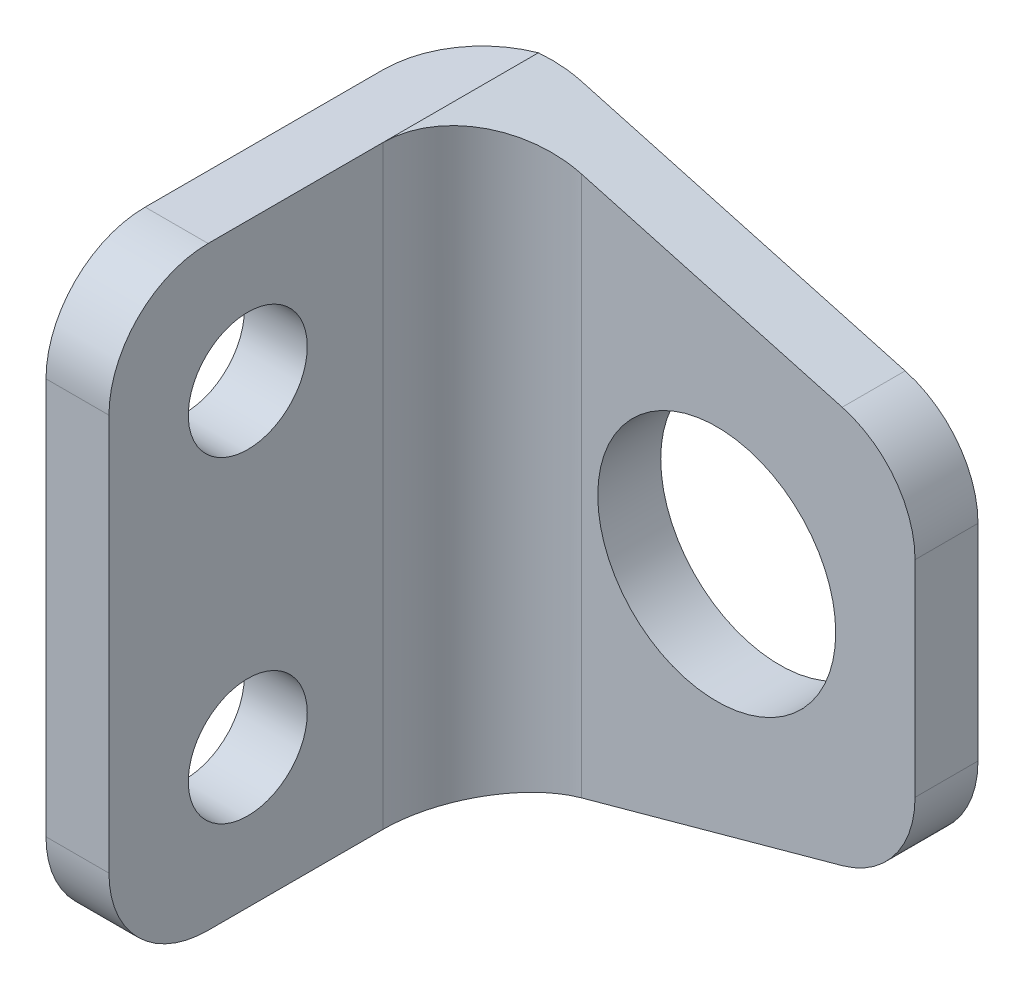
ISO-10303-21;
HEADER;
FILE_DESCRIPTION(('STEP AP214'),'2;1');
FILE_NAME('part.step','',(''),(''),'','','');
FILE_SCHEMA(('AUTOMOTIVE_DESIGN { 1 0 10303 214 1 1 1 1 }'));
ENDSEC;
DATA;
#1=APPLICATION_CONTEXT('core data for automotive mechanical design processes');
#2=APPLICATION_PROTOCOL_DEFINITION('international standard','automotive_design',2000,#1);
#3=PRODUCT_CONTEXT('',#1,'mechanical');
#4=PRODUCT('Part','Part','',(#3));
#5=PRODUCT_RELATED_PRODUCT_CATEGORY('part','',(#4));
#6=PRODUCT_DEFINITION_FORMATION('','',#4);
#7=PRODUCT_DEFINITION_CONTEXT('part definition',#1,'design');
#8=PRODUCT_DEFINITION('design','',#6,#7);
#9=PRODUCT_DEFINITION_SHAPE('','',#8);
#10=(LENGTH_UNIT() NAMED_UNIT(*) SI_UNIT(.MILLI.,.METRE.));
#11=(NAMED_UNIT(*) PLANE_ANGLE_UNIT() SI_UNIT($,.RADIAN.));
#12=(NAMED_UNIT(*) SI_UNIT($,.STERADIAN.) SOLID_ANGLE_UNIT());
#13=UNCERTAINTY_MEASURE_WITH_UNIT(LENGTH_MEASURE(1.E-05),#10,'distance_accuracy_value','');
#14=(GEOMETRIC_REPRESENTATION_CONTEXT(3) GLOBAL_UNCERTAINTY_ASSIGNED_CONTEXT((#13)) GLOBAL_UNIT_ASSIGNED_CONTEXT((#10,
#11,#12)) REPRESENTATION_CONTEXT('',''));
#15=CARTESIAN_POINT('',(0.,0.,0.));
#16=DIRECTION('',(0.,0.,1.));
#17=DIRECTION('',(1.,0.,0.));
#18=AXIS2_PLACEMENT_3D('',#15,#16,#17);
#19=CARTESIAN_POINT('',(3.175,0.,0.));
#20=DIRECTION('',(-1.,0.,0.));
#21=DIRECTION('',(0.,0.,1.));
#22=AXIS2_PLACEMENT_3D('',#19,#20,#21);
#23=PLANE('',#22);
#24=CARTESIAN_POINT('',(3.175,23.,-7.));
#25=DIRECTION('',(1.,0.,0.));
#26=DIRECTION('',(0.,0.,-1.));
#27=AXIS2_PLACEMENT_3D('',#24,#25,#26);
#28=CIRCLE('',#27,3.);
#29=CARTESIAN_POINT('',(3.175,23.,-10.));
#30=VERTEX_POINT('',#29);
#31=EDGE_CURVE('E343',#30,#30,#28,.T.);
#32=ORIENTED_EDGE('',*,*,#31,.F.);
#33=EDGE_LOOP('',(#32));
#34=FACE_BOUND('',#33,.T.);
#35=CARTESIAN_POINT('',(3.175,7.,-7.));
#36=DIRECTION('',(1.,0.,0.));
#37=DIRECTION('',(0.,0.,-1.));
#38=AXIS2_PLACEMENT_3D('',#35,#36,#37);
#39=CIRCLE('',#38,3.);
#40=CARTESIAN_POINT('',(3.175,7.,-10.));
#41=VERTEX_POINT('',#40);
#42=EDGE_CURVE('E339',#41,#41,#39,.T.);
#43=ORIENTED_EDGE('',*,*,#42,.F.);
#44=EDGE_LOOP('',(#43));
#45=FACE_BOUND('',#44,.T.);
#46=DIRECTION('',(0.,0.,1.));
#47=VECTOR('',#46,1.);
#48=CARTESIAN_POINT('',(3.175,30.,0.));
#49=LINE('',#48,#47);
#50=CARTESIAN_POINT('',(3.175,30.,-13.825));
#51=VERTEX_POINT('',#50);
#52=CARTESIAN_POINT('',(3.175,30.,-5.));
#53=VERTEX_POINT('',#52);
#54=EDGE_CURVE('E149',#51,#53,#49,.T.);
#55=ORIENTED_EDGE('',*,*,#54,.T.);
#56=CARTESIAN_POINT('',(3.175,25.,-5.));
#57=DIRECTION('',(-1.,0.,0.));
#58=DIRECTION('',(0.,0.,1.));
#59=AXIS2_PLACEMENT_3D('',#56,#57,#58);
#60=CIRCLE('',#59,5.);
#61=CARTESIAN_POINT('',(3.175,25.,0.));
#62=VERTEX_POINT('',#61);
#63=EDGE_CURVE('E211',#53,#62,#60,.F.);
#64=ORIENTED_EDGE('',*,*,#63,.T.);
#65=DIRECTION('',(0.,-1.,0.));
#66=VECTOR('',#65,1.);
#67=CARTESIAN_POINT('',(3.175,0.,0.));
#68=LINE('',#67,#66);
#69=CARTESIAN_POINT('',(3.175,5.,0.));
#70=VERTEX_POINT('',#69);
#71=EDGE_CURVE('E248',#62,#70,#68,.T.);
#72=ORIENTED_EDGE('',*,*,#71,.T.);
#73=CARTESIAN_POINT('',(3.175,5.,-5.));
#74=DIRECTION('',(-1.,0.,0.));
#75=DIRECTION('',(0.,0.,1.));
#76=AXIS2_PLACEMENT_3D('',#73,#74,#75);
#77=CIRCLE('',#76,5.);
#78=CARTESIAN_POINT('',(3.175,0.,-5.));
#79=VERTEX_POINT('',#78);
#80=EDGE_CURVE('E208',#70,#79,#77,.F.);
#81=ORIENTED_EDGE('',*,*,#80,.T.);
#82=DIRECTION('',(0.,0.,-1.));
#83=VECTOR('',#82,1.);
#84=CARTESIAN_POINT('',(3.175,0.,0.));
#85=LINE('',#84,#83);
#86=CARTESIAN_POINT('',(3.175,0.,-13.825));
#87=VERTEX_POINT('',#86);
#88=EDGE_CURVE('E236',#79,#87,#85,.T.);
#89=ORIENTED_EDGE('',*,*,#88,.T.);
#90=DIRECTION('',(0.,-1.,0.));
#91=VECTOR('',#90,1.);
#92=CARTESIAN_POINT('',(3.175,30.,-13.825));
#93=LINE('',#92,#91);
#94=EDGE_CURVE('E204',#87,#51,#93,.F.);
#95=ORIENTED_EDGE('',*,*,#94,.T.);
#96=EDGE_LOOP('',(#55,#64,#72,#81,#89,#95));
#97=FACE_BOUND('',#96,.T.);
#98=ADVANCED_FACE('F45',(#34,#45,#97),#23,.F.);
#99=CARTESIAN_POINT('',(3.175,0.,0.));
#100=DIRECTION('',(0.,0.,-1.));
#101=DIRECTION('',(-1.,0.,0.));
#102=AXIS2_PLACEMENT_3D('',#99,#100,#101);
#103=PLANE('',#102);
#104=ORIENTED_EDGE('',*,*,#71,.F.);
#105=DIRECTION('',(-1.,0.,0.));
#106=VECTOR('',#105,1.);
#107=CARTESIAN_POINT('',(3.175,25.,0.));
#108=LINE('',#107,#106);
#109=CARTESIAN_POINT('',(0.,25.,0.));
#110=VERTEX_POINT('',#109);
#111=EDGE_CURVE('E185',#62,#110,#108,.T.);
#112=ORIENTED_EDGE('',*,*,#111,.T.);
#113=DIRECTION('',(0.,-1.,0.));
#114=VECTOR('',#113,1.);
#115=CARTESIAN_POINT('',(0.,0.,0.));
#116=LINE('',#115,#114);
#117=CARTESIAN_POINT('',(0.,5.,0.));
#118=VERTEX_POINT('',#117);
#119=EDGE_CURVE('E160',#110,#118,#116,.T.);
#120=ORIENTED_EDGE('',*,*,#119,.T.);
#121=DIRECTION('',(-1.,0.,0.));
#122=VECTOR('',#121,1.);
#123=CARTESIAN_POINT('',(3.175,5.,0.));
#124=LINE('',#123,#122);
#125=EDGE_CURVE('E182',#118,#70,#124,.F.);
#126=ORIENTED_EDGE('',*,*,#125,.T.);
#127=EDGE_LOOP('',(#104,#112,#120,#126));
#128=FACE_BOUND('',#127,.T.);
#129=ADVANCED_FACE('F362',(#128),#103,.F.);
#130=CARTESIAN_POINT('',(3.175,0.,0.));
#131=DIRECTION('',(0.,1.,0.));
#132=DIRECTION('',(0.,0.,1.));
#133=AXIS2_PLACEMENT_3D('',#130,#131,#132);
#134=PLANE('',#133);
#135=ORIENTED_EDGE('',*,*,#88,.F.);
#136=DIRECTION('',(-1.,0.,0.));
#137=VECTOR('',#136,1.);
#138=CARTESIAN_POINT('',(3.175,0.,-5.));
#139=LINE('',#138,#137);
#140=CARTESIAN_POINT('',(0.,0.,-5.));
#141=VERTEX_POINT('',#140);
#142=EDGE_CURVE('E217',#79,#141,#139,.T.);
#143=ORIENTED_EDGE('',*,*,#142,.T.);
#144=DIRECTION('',(0.,0.,-1.));
#145=VECTOR('',#144,1.);
#146=CARTESIAN_POINT('',(0.,0.,0.));
#147=LINE('',#146,#145);
#148=CARTESIAN_POINT('',(0.,0.,-17.));
#149=VERTEX_POINT('',#148);
#150=EDGE_CURVE('E255',#141,#149,#147,.T.);
#151=ORIENTED_EDGE('',*,*,#150,.T.);
#152=CARTESIAN_POINT('',(5.,0.,-17.));
#153=DIRECTION('',(0.,1.,0.));
#154=DIRECTION('',(0.,0.,1.));
#155=AXIS2_PLACEMENT_3D('',#152,#153,#154);
#156=CIRCLE('',#155,5.);
#157=CARTESIAN_POINT('',(3.175,0.,-21.6550375938332));
#158=VERTEX_POINT('',#157);
#159=EDGE_CURVE('E214',#149,#158,#156,.F.);
#160=ORIENTED_EDGE('',*,*,#159,.T.);
#161=DIRECTION('',(0.,0.,-1.));
#162=VECTOR('',#161,1.);
#163=CARTESIAN_POINT('',(3.175,0.,0.001000000000001));
#164=LINE('',#163,#162);
#165=EDGE_CURVE('E62',#87,#158,#164,.T.);
#166=ORIENTED_EDGE('',*,*,#165,.F.);
#167=EDGE_LOOP('',(#135,#143,#151,#160,#166));
#168=FACE_BOUND('',#167,.T.);
#169=ADVANCED_FACE('F307',(#168),#134,.F.);
#170=CARTESIAN_POINT('',(3.175,0.,-22.));
#171=DIRECTION('',(0.,0.,1.));
#172=DIRECTION('',(1.,0.,0.));
#173=AXIS2_PLACEMENT_3D('',#170,#171,#172);
#174=PLANE('',#173);
#175=CARTESIAN_POINT('',(15.,15.,-22.));
#176=DIRECTION('',(0.,0.,-1.));
#177=DIRECTION('',(-1.,0.,0.));
#178=AXIS2_PLACEMENT_3D('',#175,#176,#177);
#179=CIRCLE('',#178,6.);
#180=CARTESIAN_POINT('',(9.,15.,-22.));
#181=VERTEX_POINT('',#180);
#182=EDGE_CURVE('E265',#181,#181,#179,.T.);
#183=ORIENTED_EDGE('',*,*,#182,.F.);
#184=EDGE_LOOP('',(#183));
#185=FACE_BOUND('',#184,.T.);
#186=DIRECTION('',(0.,-1.,0.));
#187=VECTOR('',#186,1.);
#188=CARTESIAN_POINT('',(25.,0.,-22.));
#189=LINE('',#188,#187);
#190=CARTESIAN_POINT('',(25.,20.1890672008548,-22.));
#191=VERTEX_POINT('',#190);
#192=CARTESIAN_POINT('',(25.,9.81093279914521,-22.));
#193=VERTEX_POINT('',#192);
#194=EDGE_CURVE('E144',#191,#193,#189,.T.);
#195=ORIENTED_EDGE('',*,*,#194,.T.);
#196=CARTESIAN_POINT('',(20.,9.81093279914522,-22.));
#197=DIRECTION('',(0.,0.,1.));
#198=DIRECTION('',(1.,0.,0.));
#199=AXIS2_PLACEMENT_3D('',#196,#197,#198);
#200=CIRCLE('',#199,5.);
#201=CARTESIAN_POINT('',(21.325397344826,4.98979995734049,-22.));
#202=VERTEX_POINT('',#201);
#203=EDGE_CURVE('E276',#193,#202,#200,.F.);
#204=ORIENTED_EDGE('',*,*,#203,.T.);
#205=DIRECTION('',(0.964226568360945,0.265079468965208,0.));
#206=VECTOR('',#205,1.);
#207=CARTESIAN_POINT('',(3.175,0.,-22.));
#208=LINE('',#207,#206);
#209=CARTESIAN_POINT('',(5.,0.50171821305842,-22.));
#210=VERTEX_POINT('',#209);
#211=EDGE_CURVE('E284',#210,#202,#208,.T.);
#212=ORIENTED_EDGE('',*,*,#211,.F.);
#213=DIRECTION('',(0.,1.,0.));
#214=VECTOR('',#213,1.);
#215=CARTESIAN_POINT('',(5.,30.,-22.));
#216=LINE('',#215,#214);
#217=CARTESIAN_POINT('',(5.,29.4982817869416,-22.));
#218=VERTEX_POINT('',#217);
#219=EDGE_CURVE('E269',#210,#218,#216,.T.);
#220=ORIENTED_EDGE('',*,*,#219,.T.);
#221=DIRECTION('',(-0.964226568360945,0.265079468965208,0.));
#222=VECTOR('',#221,1.);
#223=CARTESIAN_POINT('',(3.175,30.,-22.));
#224=LINE('',#223,#222);
#225=CARTESIAN_POINT('',(21.325397344826,25.0102000426595,-22.));
#226=VERTEX_POINT('',#225);
#227=EDGE_CURVE('E329',#226,#218,#224,.T.);
#228=ORIENTED_EDGE('',*,*,#227,.F.);
#229=CARTESIAN_POINT('',(20.,20.1890672008548,-22.));
#230=DIRECTION('',(0.,0.,1.));
#231=DIRECTION('',(1.,0.,0.));
#232=AXIS2_PLACEMENT_3D('',#229,#230,#231);
#233=CIRCLE('',#232,5.);
#234=EDGE_CURVE('E273',#226,#191,#233,.F.);
#235=ORIENTED_EDGE('',*,*,#234,.T.);
#236=EDGE_LOOP('',(#195,#204,#212,#220,#228,#235));
#237=FACE_BOUND('',#236,.T.);
#238=ADVANCED_FACE('F291',(#185,#237),#174,.F.);
#239=CARTESIAN_POINT('',(3.175,30.,0.));
#240=DIRECTION('',(0.,-1.,0.));
#241=DIRECTION('',(0.,0.,-1.));
#242=AXIS2_PLACEMENT_3D('',#239,#240,#241);
#243=PLANE('',#242);
#244=DIRECTION('',(0.,0.,1.));
#245=VECTOR('',#244,1.);
#246=CARTESIAN_POINT('',(0.,30.,0.));
#247=LINE('',#246,#245);
#248=CARTESIAN_POINT('',(0.,30.,-17.));
#249=VERTEX_POINT('',#248);
#250=CARTESIAN_POINT('',(0.,30.,-5.));
#251=VERTEX_POINT('',#250);
#252=EDGE_CURVE('E259',#249,#251,#247,.T.);
#253=ORIENTED_EDGE('',*,*,#252,.T.);
#254=DIRECTION('',(-1.,0.,0.));
#255=VECTOR('',#254,1.);
#256=CARTESIAN_POINT('',(3.175,30.,-5.));
#257=LINE('',#256,#255);
#258=EDGE_CURVE('E201',#251,#53,#257,.F.);
#259=ORIENTED_EDGE('',*,*,#258,.T.);
#260=ORIENTED_EDGE('',*,*,#54,.F.);
#261=DIRECTION('',(0.,0.,-1.));
#262=VECTOR('',#261,1.);
#263=CARTESIAN_POINT('',(3.175,30.,0.001000000000001));
#264=LINE('',#263,#262);
#265=CARTESIAN_POINT('',(3.175,30.,-21.6550375938332));
#266=VERTEX_POINT('',#265);
#267=EDGE_CURVE('E242',#51,#266,#264,.T.);
#268=ORIENTED_EDGE('',*,*,#267,.T.);
#269=CARTESIAN_POINT('',(5.,30.,-17.));
#270=DIRECTION('',(0.,-1.,0.));
#271=DIRECTION('',(0.,0.,-1.));
#272=AXIS2_PLACEMENT_3D('',#269,#270,#271);
#273=CIRCLE('',#272,5.);
#274=EDGE_CURVE('E198',#266,#249,#273,.F.);
#275=ORIENTED_EDGE('',*,*,#274,.T.);
#276=EDGE_LOOP('',(#253,#259,#260,#268,#275));
#277=FACE_BOUND('',#276,.T.);
#278=ADVANCED_FACE('F241',(#277),#243,.F.);
#279=CARTESIAN_POINT('',(0.,0.,0.));
#280=DIRECTION('',(-1.,0.,0.));
#281=DIRECTION('',(0.,0.,1.));
#282=AXIS2_PLACEMENT_3D('',#279,#280,#281);
#283=PLANE('',#282);
#284=CARTESIAN_POINT('',(0.,23.,-7.));
#285=DIRECTION('',(1.,0.,0.));
#286=DIRECTION('',(0.,0.,-1.));
#287=AXIS2_PLACEMENT_3D('',#284,#285,#286);
#288=CIRCLE('',#287,3.);
#289=CARTESIAN_POINT('',(0.,23.,-10.));
#290=VERTEX_POINT('',#289);
#291=EDGE_CURVE('E321',#290,#290,#288,.T.);
#292=ORIENTED_EDGE('',*,*,#291,.T.);
#293=EDGE_LOOP('',(#292));
#294=FACE_BOUND('',#293,.T.);
#295=CARTESIAN_POINT('',(0.,7.,-7.));
#296=DIRECTION('',(1.,0.,0.));
#297=DIRECTION('',(0.,0.,-1.));
#298=AXIS2_PLACEMENT_3D('',#295,#296,#297);
#299=CIRCLE('',#298,3.);
#300=CARTESIAN_POINT('',(0.,7.,-10.));
#301=VERTEX_POINT('',#300);
#302=EDGE_CURVE('E335',#301,#301,#299,.T.);
#303=ORIENTED_EDGE('',*,*,#302,.T.);
#304=EDGE_LOOP('',(#303));
#305=FACE_BOUND('',#304,.T.);
#306=ORIENTED_EDGE('',*,*,#119,.F.);
#307=CARTESIAN_POINT('',(0.,25.,-5.));
#308=DIRECTION('',(-1.,0.,0.));
#309=DIRECTION('',(0.,0.,1.));
#310=AXIS2_PLACEMENT_3D('',#307,#308,#309);
#311=CIRCLE('',#310,5.);
#312=EDGE_CURVE('E195',#110,#251,#311,.T.);
#313=ORIENTED_EDGE('',*,*,#312,.T.);
#314=ORIENTED_EDGE('',*,*,#252,.F.);
#315=DIRECTION('',(0.,1.,0.));
#316=VECTOR('',#315,1.);
#317=CARTESIAN_POINT('',(0.,0.,-17.));
#318=LINE('',#317,#316);
#319=EDGE_CURVE('E189',#249,#149,#318,.F.);
#320=ORIENTED_EDGE('',*,*,#319,.T.);
#321=ORIENTED_EDGE('',*,*,#150,.F.);
#322=CARTESIAN_POINT('',(0.,5.,-5.));
#323=DIRECTION('',(-1.,0.,0.));
#324=DIRECTION('',(0.,0.,1.));
#325=AXIS2_PLACEMENT_3D('',#322,#323,#324);
#326=CIRCLE('',#325,5.);
#327=EDGE_CURVE('E192',#141,#118,#326,.T.);
#328=ORIENTED_EDGE('',*,*,#327,.T.);
#329=EDGE_LOOP('',(#306,#313,#314,#320,#321,#328));
#330=FACE_BOUND('',#329,.T.);
#331=ADVANCED_FACE('F311',(#294,#305,#330),#283,.T.);
#332=CARTESIAN_POINT('',(0.,0.,-18.825));
#333=DIRECTION('',(0.,0.,-1.));
#334=DIRECTION('',(-1.,0.,0.));
#335=AXIS2_PLACEMENT_3D('',#332,#333,#334);
#336=PLANE('',#335);
#337=CARTESIAN_POINT('',(15.,15.,-18.825));
#338=DIRECTION('',(0.,0.,-1.));
#339=DIRECTION('',(-1.,0.,0.));
#340=AXIS2_PLACEMENT_3D('',#337,#338,#339);
#341=CIRCLE('',#340,6.);
#342=CARTESIAN_POINT('',(9.,15.,-18.825));
#343=VERTEX_POINT('',#342);
#344=EDGE_CURVE('E262',#343,#343,#341,.T.);
#345=ORIENTED_EDGE('',*,*,#344,.T.);
#346=EDGE_LOOP('',(#345));
#347=FACE_BOUND('',#346,.T.);
#348=DIRECTION('',(-0.964226568360945,-0.265079468965208,0.));
#349=VECTOR('',#348,1.);
#350=CARTESIAN_POINT('',(3.175,0.,-18.825));
#351=LINE('',#350,#349);
#352=CARTESIAN_POINT('',(21.325397344826,4.98979995734049,-18.825));
#353=VERTEX_POINT('',#352);
#354=CARTESIAN_POINT('',(8.175,1.3745704467354,-18.825));
#355=VERTEX_POINT('',#354);
#356=EDGE_CURVE('E228',#353,#355,#351,.T.);
#357=ORIENTED_EDGE('',*,*,#356,.F.);
#358=CARTESIAN_POINT('',(20.,9.81093279914522,-18.825));
#359=DIRECTION('',(0.,0.,-1.));
#360=DIRECTION('',(-1.,0.,0.));
#361=AXIS2_PLACEMENT_3D('',#358,#359,#360);
#362=CIRCLE('',#361,5.);
#363=CARTESIAN_POINT('',(25.,9.81093279914521,-18.825));
#364=VERTEX_POINT('',#363);
#365=EDGE_CURVE('E158',#353,#364,#362,.F.);
#366=ORIENTED_EDGE('',*,*,#365,.T.);
#367=DIRECTION('',(0.,-1.,0.));
#368=VECTOR('',#367,1.);
#369=CARTESIAN_POINT('',(25.,0.,-18.825));
#370=LINE('',#369,#368);
#371=CARTESIAN_POINT('',(25.,20.1890672008548,-18.825));
#372=VERTEX_POINT('',#371);
#373=EDGE_CURVE('E141',#372,#364,#370,.T.);
#374=ORIENTED_EDGE('',*,*,#373,.F.);
#375=CARTESIAN_POINT('',(20.,20.1890672008548,-18.825));
#376=DIRECTION('',(0.,0.,-1.));
#377=DIRECTION('',(-1.,0.,0.));
#378=AXIS2_PLACEMENT_3D('',#375,#376,#377);
#379=CIRCLE('',#378,5.);
#380=CARTESIAN_POINT('',(21.325397344826,25.0102000426595,-18.825));
#381=VERTEX_POINT('',#380);
#382=EDGE_CURVE('E155',#372,#381,#379,.F.);
#383=ORIENTED_EDGE('',*,*,#382,.T.);
#384=DIRECTION('',(0.964226568360945,-0.265079468965208,0.));
#385=VECTOR('',#384,1.);
#386=CARTESIAN_POINT('',(3.175,30.,-18.825));
#387=LINE('',#386,#385);
#388=CARTESIAN_POINT('',(8.175,28.6254295532646,-18.825));
#389=VERTEX_POINT('',#388);
#390=EDGE_CURVE('E287',#389,#381,#387,.T.);
#391=ORIENTED_EDGE('',*,*,#390,.F.);
#392=DIRECTION('',(0.,-1.,0.));
#393=VECTOR('',#392,1.);
#394=CARTESIAN_POINT('',(8.175,0.,-18.825));
#395=LINE('',#394,#393);
#396=EDGE_CURVE('E167',#389,#355,#395,.T.);
#397=ORIENTED_EDGE('',*,*,#396,.T.);
#398=EDGE_LOOP('',(#357,#366,#374,#383,#391,#397));
#399=FACE_BOUND('',#398,.T.);
#400=ADVANCED_FACE('F153',(#347,#399),#336,.F.);
#401=CARTESIAN_POINT('',(25.,0.,-18.825));
#402=DIRECTION('',(1.,0.,0.));
#403=DIRECTION('',(0.,0.,-1.));
#404=AXIS2_PLACEMENT_3D('',#401,#402,#403);
#405=PLANE('',#404);
#406=ORIENTED_EDGE('',*,*,#373,.T.);
#407=DIRECTION('',(0.,0.,-1.));
#408=VECTOR('',#407,1.);
#409=CARTESIAN_POINT('',(25.,9.81093279914522,-22.));
#410=LINE('',#409,#408);
#411=EDGE_CURVE('E148',#364,#193,#410,.T.);
#412=ORIENTED_EDGE('',*,*,#411,.T.);
#413=ORIENTED_EDGE('',*,*,#194,.F.);
#414=DIRECTION('',(0.,0.,-1.));
#415=VECTOR('',#414,1.);
#416=CARTESIAN_POINT('',(25.,20.1890672008548,-18.825));
#417=LINE('',#416,#415);
#418=EDGE_CURVE('E137',#191,#372,#417,.F.);
#419=ORIENTED_EDGE('',*,*,#418,.T.);
#420=EDGE_LOOP('',(#406,#412,#413,#419));
#421=FACE_BOUND('',#420,.T.);
#422=ADVANCED_FACE('F139',(#421),#405,.T.);
#423=CARTESIAN_POINT('',(15.,15.,0.));
#424=DIRECTION('',(0.,0.,-1.));
#425=DIRECTION('',(-1.,0.,0.));
#426=AXIS2_PLACEMENT_3D('',#423,#424,#425);
#427=CYLINDRICAL_SURFACE('',#426,6.);
#428=ORIENTED_EDGE('',*,*,#182,.T.);
#429=EDGE_LOOP('',(#428));
#430=FACE_BOUND('',#429,.T.);
#431=ORIENTED_EDGE('',*,*,#344,.F.);
#432=EDGE_LOOP('',(#431));
#433=FACE_BOUND('',#432,.T.);
#434=ADVANCED_FACE('F381',(#430,#433),#427,.F.);
#435=CARTESIAN_POINT('',(3.175,0.,0.001000000000001));
#436=DIRECTION('',(-0.265079468965208,0.964226568360945,0.));
#437=DIRECTION('',(-0.964226568360945,-0.265079468965208,0.));
#438=AXIS2_PLACEMENT_3D('',#435,#436,#437);
#439=PLANE('',#438);
#440=ORIENTED_EDGE('',*,*,#211,.T.);
#441=DIRECTION('',(0.,0.,-1.));
#442=VECTOR('',#441,1.);
#443=CARTESIAN_POINT('',(21.325397344826,4.98979995734049,-18.825));
#444=LINE('',#443,#442);
#445=EDGE_CURVE('E174',#202,#353,#444,.F.);
#446=ORIENTED_EDGE('',*,*,#445,.T.);
#447=ORIENTED_EDGE('',*,*,#356,.T.);
#448=CARTESIAN_POINT('',(8.175,1.3745704467354,-13.825));
#449=DIRECTION('',(-0.265079468965208,0.964226568360945,0.));
#450=DIRECTION('',(0.964226568360945,0.265079468965208,0.));
#451=AXIS2_PLACEMENT_3D('',#448,#449,#450);
#452=ELLIPSE('',#451,5.18550324588061,5.);
#453=EDGE_CURVE('E55',#355,#87,#452,.T.);
#454=ORIENTED_EDGE('',*,*,#453,.T.);
#455=ORIENTED_EDGE('',*,*,#165,.T.);
#456=CARTESIAN_POINT('',(5.,0.501718213058419,-17.));
#457=DIRECTION('',(-0.265079468965208,0.964226568360945,0.));
#458=DIRECTION('',(-0.964226568360945,-0.265079468965208,0.));
#459=AXIS2_PLACEMENT_3D('',#456,#457,#458);
#460=ELLIPSE('',#459,5.18550324588061,5.);
#461=EDGE_CURVE('E279',#158,#210,#460,.F.);
#462=ORIENTED_EDGE('',*,*,#461,.T.);
#463=EDGE_LOOP('',(#440,#446,#447,#454,#455,#462));
#464=FACE_BOUND('',#463,.T.);
#465=ADVANCED_FACE('F226',(#464),#439,.F.);
#466=CARTESIAN_POINT('',(3.175,30.,0.001000000000001));
#467=DIRECTION('',(-0.265079468965208,-0.964226568360945,0.));
#468=DIRECTION('',(0.964226568360945,-0.265079468965208,0.));
#469=AXIS2_PLACEMENT_3D('',#466,#467,#468);
#470=PLANE('',#469);
#471=ORIENTED_EDGE('',*,*,#390,.T.);
#472=DIRECTION('',(0.,0.,-1.));
#473=VECTOR('',#472,1.);
#474=CARTESIAN_POINT('',(21.325397344826,25.0102000426595,-22.));
#475=LINE('',#474,#473);
#476=EDGE_CURVE('E165',#381,#226,#475,.T.);
#477=ORIENTED_EDGE('',*,*,#476,.T.);
#478=ORIENTED_EDGE('',*,*,#227,.T.);
#479=CARTESIAN_POINT('',(5.,29.4982817869416,-17.));
#480=DIRECTION('',(-0.265079468965208,-0.964226568360945,0.));
#481=DIRECTION('',(0.964226568360945,-0.265079468965208,0.));
#482=AXIS2_PLACEMENT_3D('',#479,#480,#481);
#483=ELLIPSE('',#482,5.18550324588061,5.);
#484=EDGE_CURVE('E171',#218,#266,#483,.F.);
#485=ORIENTED_EDGE('',*,*,#484,.T.);
#486=ORIENTED_EDGE('',*,*,#267,.F.);
#487=CARTESIAN_POINT('',(8.175,28.6254295532646,-13.825));
#488=DIRECTION('',(-0.265079468965208,-0.964226568360945,0.));
#489=DIRECTION('',(-0.964226568360945,0.265079468965208,0.));
#490=AXIS2_PLACEMENT_3D('',#487,#488,#489);
#491=ELLIPSE('',#490,5.18550324588061,5.);
#492=EDGE_CURVE('E11',#51,#389,#491,.T.);
#493=ORIENTED_EDGE('',*,*,#492,.T.);
#494=EDGE_LOOP('',(#471,#477,#478,#485,#486,#493));
#495=FACE_BOUND('',#494,.T.);
#496=ADVANCED_FACE('F375',(#495),#470,.F.);
#497=CARTESIAN_POINT('',(20.,9.81093279914522,-18.825));
#498=DIRECTION('',(0.,0.,1.));
#499=DIRECTION('',(1.,0.,0.));
#500=AXIS2_PLACEMENT_3D('',#497,#498,#499);
#501=CYLINDRICAL_SURFACE('',#500,5.);
#502=ORIENTED_EDGE('',*,*,#365,.F.);
#503=ORIENTED_EDGE('',*,*,#445,.F.);
#504=ORIENTED_EDGE('',*,*,#203,.F.);
#505=ORIENTED_EDGE('',*,*,#411,.F.);
#506=EDGE_LOOP('',(#502,#503,#504,#505));
#507=FACE_BOUND('',#506,.T.);
#508=ADVANCED_FACE('F289',(#507),#501,.T.);
#509=CARTESIAN_POINT('',(20.,20.1890672008548,0.001000000000001));
#510=DIRECTION('',(0.,0.,1.));
#511=DIRECTION('',(1.,0.,0.));
#512=AXIS2_PLACEMENT_3D('',#509,#510,#511);
#513=CYLINDRICAL_SURFACE('',#512,5.);
#514=ORIENTED_EDGE('',*,*,#382,.F.);
#515=ORIENTED_EDGE('',*,*,#418,.F.);
#516=ORIENTED_EDGE('',*,*,#234,.F.);
#517=ORIENTED_EDGE('',*,*,#476,.F.);
#518=EDGE_LOOP('',(#514,#515,#516,#517));
#519=FACE_BOUND('',#518,.T.);
#520=ADVANCED_FACE('F163',(#519),#513,.T.);
#521=CARTESIAN_POINT('',(3.175,25.,-5.));
#522=DIRECTION('',(-1.,0.,0.));
#523=DIRECTION('',(0.,0.,1.));
#524=AXIS2_PLACEMENT_3D('',#521,#522,#523);
#525=CYLINDRICAL_SURFACE('',#524,5.);
#526=ORIENTED_EDGE('',*,*,#63,.F.);
#527=ORIENTED_EDGE('',*,*,#258,.F.);
#528=ORIENTED_EDGE('',*,*,#312,.F.);
#529=ORIENTED_EDGE('',*,*,#111,.F.);
#530=EDGE_LOOP('',(#526,#527,#528,#529));
#531=FACE_BOUND('',#530,.T.);
#532=ADVANCED_FACE('F403',(#531),#525,.T.);
#533=CARTESIAN_POINT('',(3.175,5.,-5.));
#534=DIRECTION('',(-1.,0.,0.));
#535=DIRECTION('',(0.,0.,1.));
#536=AXIS2_PLACEMENT_3D('',#533,#534,#535);
#537=CYLINDRICAL_SURFACE('',#536,5.);
#538=ORIENTED_EDGE('',*,*,#80,.F.);
#539=ORIENTED_EDGE('',*,*,#125,.F.);
#540=ORIENTED_EDGE('',*,*,#327,.F.);
#541=ORIENTED_EDGE('',*,*,#142,.F.);
#542=EDGE_LOOP('',(#538,#539,#540,#541));
#543=FACE_BOUND('',#542,.T.);
#544=ADVANCED_FACE('F305',(#543),#537,.T.);
#545=CARTESIAN_POINT('',(5.,0.,-17.));
#546=DIRECTION('',(0.,-1.,0.));
#547=DIRECTION('',(0.,0.,-1.));
#548=AXIS2_PLACEMENT_3D('',#545,#546,#547);
#549=CYLINDRICAL_SURFACE('',#548,5.);
#550=ORIENTED_EDGE('',*,*,#159,.F.);
#551=ORIENTED_EDGE('',*,*,#319,.F.);
#552=ORIENTED_EDGE('',*,*,#274,.F.);
#553=ORIENTED_EDGE('',*,*,#484,.F.);
#554=ORIENTED_EDGE('',*,*,#219,.F.);
#555=ORIENTED_EDGE('',*,*,#461,.F.);
#556=EDGE_LOOP('',(#550,#551,#552,#553,#554,#555));
#557=FACE_BOUND('',#556,.T.);
#558=ADVANCED_FACE('F315',(#557),#549,.T.);
#559=CARTESIAN_POINT('',(8.175,0.,-13.825));
#560=DIRECTION('',(0.,1.,0.));
#561=DIRECTION('',(0.,0.,1.));
#562=AXIS2_PLACEMENT_3D('',#559,#560,#561);
#563=CYLINDRICAL_SURFACE('',#562,5.);
#564=ORIENTED_EDGE('',*,*,#492,.F.);
#565=ORIENTED_EDGE('',*,*,#94,.F.);
#566=ORIENTED_EDGE('',*,*,#453,.F.);
#567=ORIENTED_EDGE('',*,*,#396,.F.);
#568=EDGE_LOOP('',(#564,#565,#566,#567));
#569=FACE_BOUND('',#568,.T.);
#570=ADVANCED_FACE('F47',(#569),#563,.F.);
#571=CARTESIAN_POINT('',(0.,7.,-7.));
#572=DIRECTION('',(1.,0.,0.));
#573=DIRECTION('',(0.,0.,-1.));
#574=AXIS2_PLACEMENT_3D('',#571,#572,#573);
#575=CYLINDRICAL_SURFACE('',#574,3.);
#576=ORIENTED_EDGE('',*,*,#302,.F.);
#577=EDGE_LOOP('',(#576));
#578=FACE_BOUND('',#577,.T.);
#579=ORIENTED_EDGE('',*,*,#42,.T.);
#580=EDGE_LOOP('',(#579));
#581=FACE_BOUND('',#580,.T.);
#582=ADVANCED_FACE('F356',(#578,#581),#575,.F.);
#583=CARTESIAN_POINT('',(0.,23.,-7.));
#584=DIRECTION('',(1.,0.,0.));
#585=DIRECTION('',(0.,0.,-1.));
#586=AXIS2_PLACEMENT_3D('',#583,#584,#585);
#587=CYLINDRICAL_SURFACE('',#586,3.);
#588=ORIENTED_EDGE('',*,*,#291,.F.);
#589=EDGE_LOOP('',(#588));
#590=FACE_BOUND('',#589,.T.);
#591=ORIENTED_EDGE('',*,*,#31,.T.);
#592=EDGE_LOOP('',(#591));
#593=FACE_BOUND('',#592,.T.);
#594=ADVANCED_FACE('F353',(#590,#593),#587,.F.);
#595=CLOSED_SHELL('',(#98,#129,#169,#238,#278,#331,#400,#422,#434,#465,#496,#508,#520,#532,#544,
#558,#570,#582,#594));
#596=MANIFOLD_SOLID_BREP('B2',#595);
#597=ADVANCED_BREP_SHAPE_REPRESENTATION('',(#18,#596),#14);
#598=SHAPE_DEFINITION_REPRESENTATION(#9,#597);
ENDSEC;
END-ISO-10303-21;
